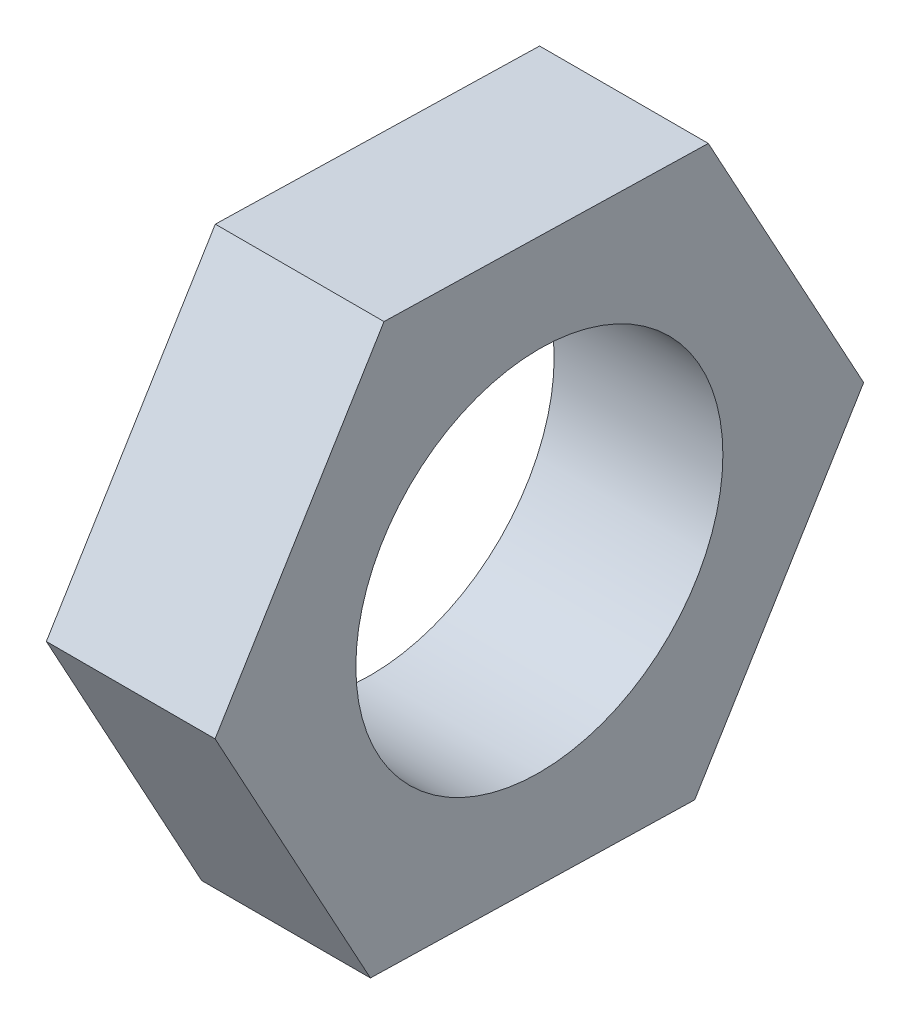
ISO-10303-21;
HEADER;
FILE_DESCRIPTION(('STEP AP214'),'2;1');
FILE_NAME('part.step','',(''),(''),'','','');
FILE_SCHEMA(('AUTOMOTIVE_DESIGN { 1 0 10303 214 1 1 1 1 }'));
ENDSEC;
DATA;
#1=APPLICATION_CONTEXT('core data for automotive mechanical design processes');
#2=APPLICATION_PROTOCOL_DEFINITION('international standard','automotive_design',2000,#1);
#3=PRODUCT_CONTEXT('',#1,'mechanical');
#4=PRODUCT('Part','Part','',(#3));
#5=PRODUCT_RELATED_PRODUCT_CATEGORY('part','',(#4));
#6=PRODUCT_DEFINITION_FORMATION('','',#4);
#7=PRODUCT_DEFINITION_CONTEXT('part definition',#1,'design');
#8=PRODUCT_DEFINITION('design','',#6,#7);
#9=PRODUCT_DEFINITION_SHAPE('','',#8);
#10=(LENGTH_UNIT() NAMED_UNIT(*) SI_UNIT(.MILLI.,.METRE.));
#11=(NAMED_UNIT(*) PLANE_ANGLE_UNIT() SI_UNIT($,.RADIAN.));
#12=(NAMED_UNIT(*) SI_UNIT($,.STERADIAN.) SOLID_ANGLE_UNIT());
#13=UNCERTAINTY_MEASURE_WITH_UNIT(LENGTH_MEASURE(1.E-05),#10,'distance_accuracy_value','');
#14=(GEOMETRIC_REPRESENTATION_CONTEXT(3) GLOBAL_UNCERTAINTY_ASSIGNED_CONTEXT((#13)) GLOBAL_UNIT_ASSIGNED_CONTEXT((#10,
#11,#12)) REPRESENTATION_CONTEXT('',''));
#15=CARTESIAN_POINT('',(0.,0.,0.));
#16=DIRECTION('',(0.,0.,1.));
#17=DIRECTION('',(1.,0.,0.));
#18=AXIS2_PLACEMENT_3D('',#15,#16,#17);
#19=CARTESIAN_POINT('',(-9.490202,51.1643081984232,-355.413788587456));
#20=DIRECTION('',(0.,0.520831449086538,0.853659534968372));
#21=DIRECTION('',(0.,-0.853659534968372,0.520831449086538));
#22=AXIS2_PLACEMENT_3D('',#19,#20,#21);
#23=PLANE('',#22);
#24=DIRECTION('',(0.,-0.853659534968372,0.520831449086538));
#25=VECTOR('',#24,1.);
#26=CARTESIAN_POINT('',(0.,51.1643081984232,-355.413788587456));
#27=LINE('',#26,#25);
#28=CARTESIAN_POINT('',(0.,51.1643081984232,-355.413788587456));
#29=VERTEX_POINT('',#28);
#30=CARTESIAN_POINT('',(0.,35.58921,-345.91117));
#31=VERTEX_POINT('',#30);
#32=EDGE_CURVE('E118',#29,#31,#27,.T.);
#33=ORIENTED_EDGE('',*,*,#32,.F.);
#34=DIRECTION('',(1.,0.,0.));
#35=VECTOR('',#34,1.);
#36=CARTESIAN_POINT('',(-9.490202,51.1643081984232,-355.413788587456));
#37=LINE('',#36,#35);
#38=CARTESIAN_POINT('',(-9.490202,51.1643081984232,-355.413788587456));
#39=VERTEX_POINT('',#38);
#40=EDGE_CURVE('E11',#39,#29,#37,.T.);
#41=ORIENTED_EDGE('',*,*,#40,.F.);
#42=DIRECTION('',(0.,-0.853659534968372,0.520831449086538));
#43=VECTOR('',#42,1.);
#44=CARTESIAN_POINT('',(-9.490202,51.1643081984232,-355.413788587456));
#45=LINE('',#44,#43);
#46=CARTESIAN_POINT('',(-9.490202,35.58921,-345.91117));
#47=VERTEX_POINT('',#46);
#48=EDGE_CURVE('E133',#39,#47,#45,.T.);
#49=ORIENTED_EDGE('',*,*,#48,.T.);
#50=DIRECTION('',(1.,0.,0.));
#51=VECTOR('',#50,1.);
#52=CARTESIAN_POINT('',(-9.490202,35.58921,-345.91117));
#53=LINE('',#52,#51);
#54=EDGE_CURVE('E36',#47,#31,#53,.T.);
#55=ORIENTED_EDGE('',*,*,#54,.T.);
#56=EDGE_LOOP('',(#33,#41,#49,#55));
#57=FACE_BOUND('',#56,.T.);
#58=ADVANCED_FACE('F33',(#57),#23,.T.);
#59=CARTESIAN_POINT('',(-9.490202,50.7223481984232,-373.653528587457));
#60=DIRECTION('',(0.,0.999706568008689,-0.0242234985146194));
#61=DIRECTION('',(0.,0.0242234985146194,0.99970656800869));
#62=AXIS2_PLACEMENT_3D('',#59,#60,#61);
#63=PLANE('',#62);
#64=DIRECTION('',(0.,0.0242234985146194,0.999706568008689));
#65=VECTOR('',#64,1.);
#66=CARTESIAN_POINT('',(0.,50.7223481984232,-373.653528587457));
#67=LINE('',#66,#65);
#68=CARTESIAN_POINT('',(0.,50.7223481984232,-373.653528587457));
#69=VERTEX_POINT('',#68);
#70=EDGE_CURVE('E131',#69,#29,#67,.T.);
#71=ORIENTED_EDGE('',*,*,#70,.F.);
#72=DIRECTION('',(1.,0.,0.));
#73=VECTOR('',#72,1.);
#74=CARTESIAN_POINT('',(-9.490202,50.7223481984232,-373.653528587457));
#75=LINE('',#74,#73);
#76=CARTESIAN_POINT('',(-9.490202,50.7223481984232,-373.653528587457));
#77=VERTEX_POINT('',#76);
#78=EDGE_CURVE('E42',#77,#69,#75,.T.);
#79=ORIENTED_EDGE('',*,*,#78,.F.);
#80=DIRECTION('',(0.,0.0242234985146194,0.999706568008689));
#81=VECTOR('',#80,1.);
#82=CARTESIAN_POINT('',(-9.490202,50.7223481984232,-373.653528587457));
#83=LINE('',#82,#81);
#84=EDGE_CURVE('E108',#77,#39,#83,.T.);
#85=ORIENTED_EDGE('',*,*,#84,.T.);
#86=ORIENTED_EDGE('',*,*,#40,.T.);
#87=EDGE_LOOP('',(#71,#79,#85,#86));
#88=FACE_BOUND('',#87,.T.);
#89=ADVANCED_FACE('F141',(#88),#63,.T.);
#90=CARTESIAN_POINT('',(-9.490202,34.70529,-382.39065));
#91=DIRECTION('',(0.,0.478875118922142,-0.877883033482995));
#92=DIRECTION('',(0.,0.877883033482995,0.478875118922142));
#93=AXIS2_PLACEMENT_3D('',#90,#91,#92);
#94=PLANE('',#93);
#95=DIRECTION('',(0.,0.877883033482995,0.478875118922142));
#96=VECTOR('',#95,1.);
#97=CARTESIAN_POINT('',(0.,34.70529,-382.39065));
#98=LINE('',#97,#96);
#99=CARTESIAN_POINT('',(0.,34.70529,-382.39065));
#100=VERTEX_POINT('',#99);
#101=EDGE_CURVE('E95',#100,#69,#98,.T.);
#102=ORIENTED_EDGE('',*,*,#101,.F.);
#103=DIRECTION('',(1.,0.,0.));
#104=VECTOR('',#103,1.);
#105=CARTESIAN_POINT('',(-9.490202,34.70529,-382.39065));
#106=LINE('',#105,#104);
#107=CARTESIAN_POINT('',(-9.490202,34.70529,-382.39065));
#108=VERTEX_POINT('',#107);
#109=EDGE_CURVE('E90',#108,#100,#106,.T.);
#110=ORIENTED_EDGE('',*,*,#109,.F.);
#111=DIRECTION('',(0.,0.877883033482995,0.478875118922142));
#112=VECTOR('',#111,1.);
#113=CARTESIAN_POINT('',(-9.490202,34.70529,-382.39065));
#114=LINE('',#113,#112);
#115=EDGE_CURVE('E93',#108,#77,#114,.T.);
#116=ORIENTED_EDGE('',*,*,#115,.T.);
#117=ORIENTED_EDGE('',*,*,#78,.T.);
#118=EDGE_LOOP('',(#102,#110,#116,#117));
#119=FACE_BOUND('',#118,.T.);
#120=ADVANCED_FACE('F92',(#119),#94,.T.);
#121=CARTESIAN_POINT('',(-9.490202,19.1301918015769,-372.888031412544));
#122=DIRECTION('',(0.,-0.52083144908654,-0.853659534968371));
#123=DIRECTION('',(0.,0.853659534968371,-0.52083144908654));
#124=AXIS2_PLACEMENT_3D('',#121,#122,#123);
#125=PLANE('',#124);
#126=DIRECTION('',(0.,0.853659534968371,-0.52083144908654));
#127=VECTOR('',#126,1.);
#128=CARTESIAN_POINT('',(0.,19.1301918015769,-372.888031412544));
#129=LINE('',#128,#127);
#130=CARTESIAN_POINT('',(0.,19.1301918015769,-372.888031412544));
#131=VERTEX_POINT('',#130);
#132=EDGE_CURVE('E128',#131,#100,#129,.T.);
#133=ORIENTED_EDGE('',*,*,#132,.F.);
#134=DIRECTION('',(1.,0.,0.));
#135=VECTOR('',#134,1.);
#136=CARTESIAN_POINT('',(-9.490202,19.1301918015769,-372.888031412544));
#137=LINE('',#136,#135);
#138=CARTESIAN_POINT('',(-9.490202,19.1301918015769,-372.888031412544));
#139=VERTEX_POINT('',#138);
#140=EDGE_CURVE('E100',#139,#131,#137,.T.);
#141=ORIENTED_EDGE('',*,*,#140,.F.);
#142=DIRECTION('',(0.,0.853659534968371,-0.52083144908654));
#143=VECTOR('',#142,1.);
#144=CARTESIAN_POINT('',(-9.490202,19.1301918015769,-372.888031412544));
#145=LINE('',#144,#143);
#146=EDGE_CURVE('E106',#139,#108,#145,.T.);
#147=ORIENTED_EDGE('',*,*,#146,.T.);
#148=ORIENTED_EDGE('',*,*,#109,.T.);
#149=EDGE_LOOP('',(#133,#141,#147,#148));
#150=FACE_BOUND('',#149,.T.);
#151=ADVANCED_FACE('F110',(#150),#125,.T.);
#152=CARTESIAN_POINT('',(-9.490202,19.5721518015768,-354.648291412544));
#153=DIRECTION('',(0.,-0.999706568008689,0.0242234985146197));
#154=DIRECTION('',(0.,-0.0242234985146197,-0.99970656800869));
#155=AXIS2_PLACEMENT_3D('',#152,#153,#154);
#156=PLANE('',#155);
#157=DIRECTION('',(0.,-0.0242234985146197,-0.999706568008689));
#158=VECTOR('',#157,1.);
#159=CARTESIAN_POINT('',(0.,19.5721518015768,-354.648291412544));
#160=LINE('',#159,#158);
#161=CARTESIAN_POINT('',(0.,19.5721518015768,-354.648291412544));
#162=VERTEX_POINT('',#161);
#163=EDGE_CURVE('E125',#162,#131,#160,.T.);
#164=ORIENTED_EDGE('',*,*,#163,.F.);
#165=DIRECTION('',(1.,0.,0.));
#166=VECTOR('',#165,1.);
#167=CARTESIAN_POINT('',(-9.490202,19.5721518015768,-354.648291412544));
#168=LINE('',#167,#166);
#169=CARTESIAN_POINT('',(-9.490202,19.5721518015768,-354.648291412544));
#170=VERTEX_POINT('',#169);
#171=EDGE_CURVE('E136',#170,#162,#168,.T.);
#172=ORIENTED_EDGE('',*,*,#171,.F.);
#173=DIRECTION('',(0.,-0.0242234985146197,-0.999706568008689));
#174=VECTOR('',#173,1.);
#175=CARTESIAN_POINT('',(-9.490202,19.5721518015768,-354.648291412544));
#176=LINE('',#175,#174);
#177=EDGE_CURVE('E111',#170,#139,#176,.T.);
#178=ORIENTED_EDGE('',*,*,#177,.T.);
#179=ORIENTED_EDGE('',*,*,#140,.T.);
#180=EDGE_LOOP('',(#164,#172,#178,#179));
#181=FACE_BOUND('',#180,.T.);
#182=ADVANCED_FACE('F154',(#181),#156,.T.);
#183=CARTESIAN_POINT('',(-9.490202,35.58921,-345.91117));
#184=DIRECTION('',(0.,-0.478875118922149,0.87788303348299));
#185=DIRECTION('',(0.,-0.877883033482991,-0.478875118922149));
#186=AXIS2_PLACEMENT_3D('',#183,#184,#185);
#187=PLANE('',#186);
#188=DIRECTION('',(0.,-0.87788303348299,-0.478875118922149));
#189=VECTOR('',#188,1.);
#190=CARTESIAN_POINT('',(0.,35.58921,-345.91117));
#191=LINE('',#190,#189);
#192=EDGE_CURVE('E121',#31,#162,#191,.T.);
#193=ORIENTED_EDGE('',*,*,#192,.F.);
#194=ORIENTED_EDGE('',*,*,#54,.F.);
#195=DIRECTION('',(0.,-0.87788303348299,-0.478875118922149));
#196=VECTOR('',#195,1.);
#197=CARTESIAN_POINT('',(-9.490202,35.58921,-345.91117));
#198=LINE('',#197,#196);
#199=EDGE_CURVE('E113',#47,#170,#198,.T.);
#200=ORIENTED_EDGE('',*,*,#199,.T.);
#201=ORIENTED_EDGE('',*,*,#171,.T.);
#202=EDGE_LOOP('',(#193,#194,#200,#201));
#203=FACE_BOUND('',#202,.T.);
#204=ADVANCED_FACE('F138',(#203),#187,.T.);
#205=CARTESIAN_POINT('',(-9.490202,0.,0.));
#206=DIRECTION('',(1.,0.,0.));
#207=DIRECTION('',(0.,0.,-1.));
#208=AXIS2_PLACEMENT_3D('',#205,#206,#207);
#209=PLANE('',#208);
#210=CARTESIAN_POINT('',(-9.490202,35.14725,-364.15091));
#211=DIRECTION('',(1.,0.,0.));
#212=DIRECTION('',(0.,0.,-1.));
#213=AXIS2_PLACEMENT_3D('',#210,#211,#212);
#214=CIRCLE('',#213,10.322814);
#215=CARTESIAN_POINT('',(-9.490202,35.14725,-374.473724));
#216=VERTEX_POINT('',#215);
#217=EDGE_CURVE('E122',#216,#216,#214,.T.);
#218=ORIENTED_EDGE('',*,*,#217,.T.);
#219=EDGE_LOOP('',(#218));
#220=FACE_BOUND('',#219,.T.);
#221=ORIENTED_EDGE('',*,*,#48,.F.);
#222=ORIENTED_EDGE('',*,*,#84,.F.);
#223=ORIENTED_EDGE('',*,*,#115,.F.);
#224=ORIENTED_EDGE('',*,*,#146,.F.);
#225=ORIENTED_EDGE('',*,*,#177,.F.);
#226=ORIENTED_EDGE('',*,*,#199,.F.);
#227=EDGE_LOOP('',(#221,#222,#223,#224,#225,#226));
#228=FACE_BOUND('',#227,.T.);
#229=ADVANCED_FACE('F104',(#220,#228),#209,.F.);
#230=CARTESIAN_POINT('',(0.,0.,0.));
#231=DIRECTION('',(1.,0.,0.));
#232=DIRECTION('',(0.,0.,-1.));
#233=AXIS2_PLACEMENT_3D('',#230,#231,#232);
#234=PLANE('',#233);
#235=CARTESIAN_POINT('',(0.,35.14725,-364.15091));
#236=DIRECTION('',(1.,0.,0.));
#237=DIRECTION('',(0.,0.,-1.));
#238=AXIS2_PLACEMENT_3D('',#235,#236,#237);
#239=CIRCLE('',#238,10.322814);
#240=CARTESIAN_POINT('',(0.,35.14725,-374.473724));
#241=VERTEX_POINT('',#240);
#242=EDGE_CURVE('E177',#241,#241,#239,.T.);
#243=ORIENTED_EDGE('',*,*,#242,.F.);
#244=EDGE_LOOP('',(#243));
#245=FACE_BOUND('',#244,.T.);
#246=ORIENTED_EDGE('',*,*,#32,.T.);
#247=ORIENTED_EDGE('',*,*,#192,.T.);
#248=ORIENTED_EDGE('',*,*,#163,.T.);
#249=ORIENTED_EDGE('',*,*,#132,.T.);
#250=ORIENTED_EDGE('',*,*,#101,.T.);
#251=ORIENTED_EDGE('',*,*,#70,.T.);
#252=EDGE_LOOP('',(#246,#247,#248,#249,#250,#251));
#253=FACE_BOUND('',#252,.T.);
#254=ADVANCED_FACE('F140',(#245,#253),#234,.T.);
#255=CARTESIAN_POINT('',(-9.490202,35.14725,-364.15091));
#256=DIRECTION('',(1.,0.,0.));
#257=DIRECTION('',(0.,0.,-1.));
#258=AXIS2_PLACEMENT_3D('',#255,#256,#257);
#259=CYLINDRICAL_SURFACE('',#258,10.322814);
#260=ORIENTED_EDGE('',*,*,#217,.F.);
#261=EDGE_LOOP('',(#260));
#262=FACE_BOUND('',#261,.T.);
#263=ORIENTED_EDGE('',*,*,#242,.T.);
#264=EDGE_LOOP('',(#263));
#265=FACE_BOUND('',#264,.T.);
#266=ADVANCED_FACE('F165',(#262,#265),#259,.F.);
#267=CLOSED_SHELL('',(#58,#89,#120,#151,#182,#204,#229,#254,#266));
#268=MANIFOLD_SOLID_BREP('B2',#267);
#269=ADVANCED_BREP_SHAPE_REPRESENTATION('',(#18,#268),#14);
#270=SHAPE_DEFINITION_REPRESENTATION(#9,#269);
ENDSEC;
END-ISO-10303-21;
